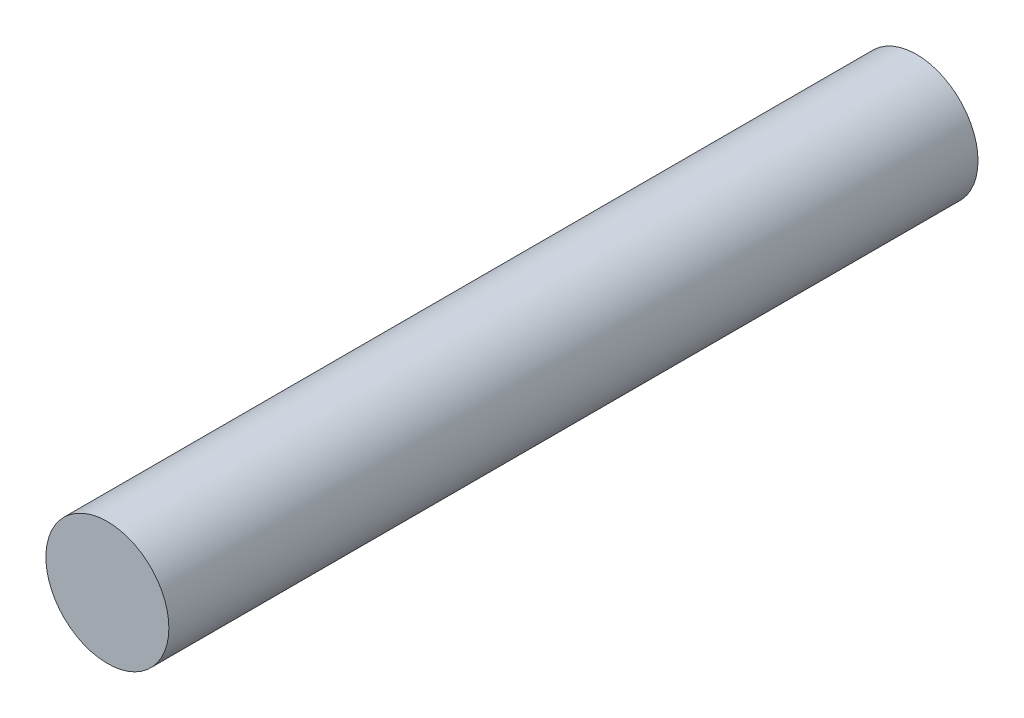
ISO-10303-21;
HEADER;
FILE_DESCRIPTION(('STEP AP214'),'2;1');
FILE_NAME('part.step','',(''),(''),'','','');
FILE_SCHEMA(('AUTOMOTIVE_DESIGN { 1 0 10303 214 1 1 1 1 }'));
ENDSEC;
DATA;
#1=APPLICATION_CONTEXT('core data for automotive mechanical design processes');
#2=APPLICATION_PROTOCOL_DEFINITION('international standard','automotive_design',2000,#1);
#3=PRODUCT_CONTEXT('',#1,'mechanical');
#4=PRODUCT('Part','Part','',(#3));
#5=PRODUCT_RELATED_PRODUCT_CATEGORY('part','',(#4));
#6=PRODUCT_DEFINITION_FORMATION('','',#4);
#7=PRODUCT_DEFINITION_CONTEXT('part definition',#1,'design');
#8=PRODUCT_DEFINITION('design','',#6,#7);
#9=PRODUCT_DEFINITION_SHAPE('','',#8);
#10=(LENGTH_UNIT() NAMED_UNIT(*) SI_UNIT(.MILLI.,.METRE.));
#11=(NAMED_UNIT(*) PLANE_ANGLE_UNIT() SI_UNIT($,.RADIAN.));
#12=(NAMED_UNIT(*) SI_UNIT($,.STERADIAN.) SOLID_ANGLE_UNIT());
#13=UNCERTAINTY_MEASURE_WITH_UNIT(LENGTH_MEASURE(1.E-05),#10,'distance_accuracy_value','');
#14=(GEOMETRIC_REPRESENTATION_CONTEXT(3) GLOBAL_UNCERTAINTY_ASSIGNED_CONTEXT((#13)) GLOBAL_UNIT_ASSIGNED_CONTEXT((#10,
#11,#12)) REPRESENTATION_CONTEXT('',''));
#15=CARTESIAN_POINT('',(0.,0.,0.));
#16=DIRECTION('',(0.,0.,1.));
#17=DIRECTION('',(1.,0.,0.));
#18=AXIS2_PLACEMENT_3D('',#15,#16,#17);
#19=CARTESIAN_POINT('',(0.,0.,250.));
#20=DIRECTION('',(0.,0.,-1.));
#21=DIRECTION('',(-1.,0.,0.));
#22=AXIS2_PLACEMENT_3D('',#19,#20,#21);
#23=CYLINDRICAL_SURFACE('',#22,19.);
#24=CARTESIAN_POINT('',(0.,0.,250.));
#25=DIRECTION('',(0.,0.,1.));
#26=DIRECTION('',(1.,0.,0.));
#27=AXIS2_PLACEMENT_3D('',#24,#25,#26);
#28=CIRCLE('',#27,19.);
#29=CARTESIAN_POINT('',(19.,0.,250.));
#30=VERTEX_POINT('',#29);
#31=EDGE_CURVE('E10',#30,#30,#28,.T.);
#32=ORIENTED_EDGE('',*,*,#31,.F.);
#33=EDGE_LOOP('',(#32));
#34=FACE_BOUND('',#33,.T.);
#35=CARTESIAN_POINT('',(0.,0.,0.));
#36=DIRECTION('',(0.,0.,1.));
#37=DIRECTION('',(1.,0.,0.));
#38=AXIS2_PLACEMENT_3D('',#35,#36,#37);
#39=CIRCLE('',#38,19.);
#40=CARTESIAN_POINT('',(19.,0.,0.));
#41=VERTEX_POINT('',#40);
#42=EDGE_CURVE('E34',#41,#41,#39,.T.);
#43=ORIENTED_EDGE('',*,*,#42,.T.);
#44=EDGE_LOOP('',(#43));
#45=FACE_BOUND('',#44,.T.);
#46=ADVANCED_FACE('F31',(#34,#45),#23,.T.);
#47=CARTESIAN_POINT('',(0.,0.,250.));
#48=DIRECTION('',(0.,0.,1.));
#49=DIRECTION('',(1.,0.,0.));
#50=AXIS2_PLACEMENT_3D('',#47,#48,#49);
#51=PLANE('',#50);
#52=ORIENTED_EDGE('',*,*,#31,.T.);
#53=EDGE_LOOP('',(#52));
#54=FACE_BOUND('',#53,.T.);
#55=ADVANCED_FACE('F46',(#54),#51,.T.);
#56=CARTESIAN_POINT('',(0.,0.,0.));
#57=DIRECTION('',(0.,0.,1.));
#58=DIRECTION('',(1.,0.,0.));
#59=AXIS2_PLACEMENT_3D('',#56,#57,#58);
#60=PLANE('',#59);
#61=ORIENTED_EDGE('',*,*,#42,.F.);
#62=EDGE_LOOP('',(#61));
#63=FACE_BOUND('',#62,.T.);
#64=ADVANCED_FACE('F44',(#63),#60,.F.);
#65=CLOSED_SHELL('',(#46,#55,#64));
#66=MANIFOLD_SOLID_BREP('B2',#65);
#67=ADVANCED_BREP_SHAPE_REPRESENTATION('',(#18,#66),#14);
#68=SHAPE_DEFINITION_REPRESENTATION(#9,#67);
ENDSEC;
END-ISO-10303-21;
